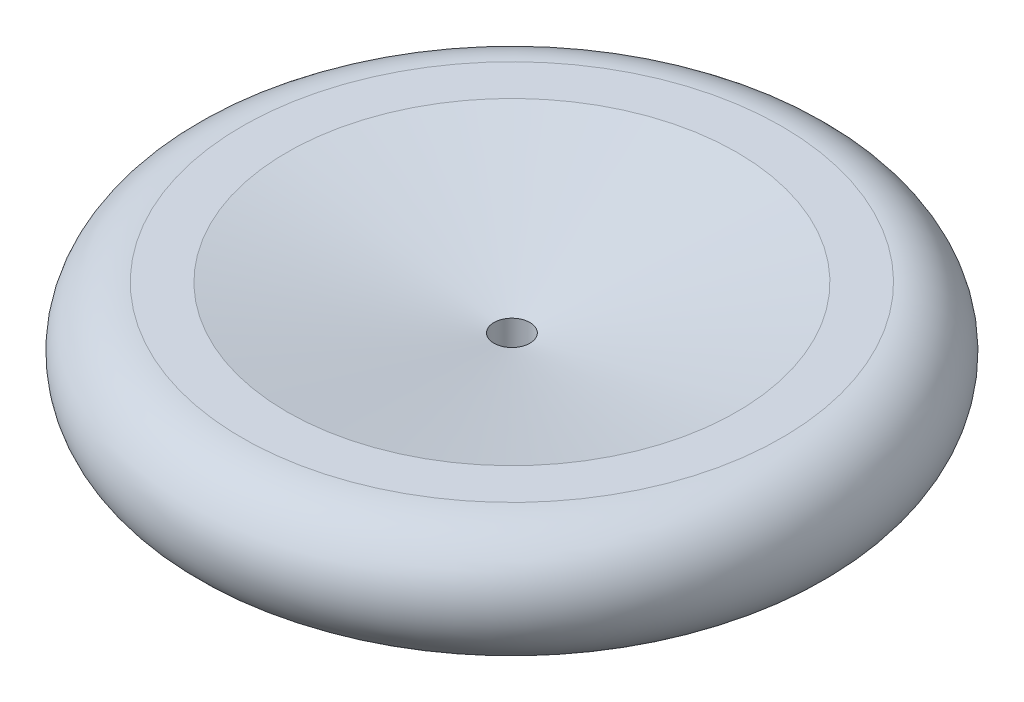
ISO-10303-21;
HEADER;
FILE_DESCRIPTION(('STEP AP214'),'2;1');
FILE_NAME('part.step','',(''),(''),'','','');
FILE_SCHEMA(('AUTOMOTIVE_DESIGN { 1 0 10303 214 1 1 1 1 }'));
ENDSEC;
DATA;
#1=APPLICATION_CONTEXT('core data for automotive mechanical design processes');
#2=APPLICATION_PROTOCOL_DEFINITION('international standard','automotive_design',2000,#1);
#3=PRODUCT_CONTEXT('',#1,'mechanical');
#4=PRODUCT('Part','Part','',(#3));
#5=PRODUCT_RELATED_PRODUCT_CATEGORY('part','',(#4));
#6=PRODUCT_DEFINITION_FORMATION('','',#4);
#7=PRODUCT_DEFINITION_CONTEXT('part definition',#1,'design');
#8=PRODUCT_DEFINITION('design','',#6,#7);
#9=PRODUCT_DEFINITION_SHAPE('','',#8);
#10=(LENGTH_UNIT() NAMED_UNIT(*) SI_UNIT(.MILLI.,.METRE.));
#11=(NAMED_UNIT(*) PLANE_ANGLE_UNIT() SI_UNIT($,.RADIAN.));
#12=(NAMED_UNIT(*) SI_UNIT($,.STERADIAN.) SOLID_ANGLE_UNIT());
#13=UNCERTAINTY_MEASURE_WITH_UNIT(LENGTH_MEASURE(1.E-05),#10,'distance_accuracy_value','');
#14=(GEOMETRIC_REPRESENTATION_CONTEXT(3) GLOBAL_UNCERTAINTY_ASSIGNED_CONTEXT((#13)) GLOBAL_UNIT_ASSIGNED_CONTEXT((#10,
#11,#12)) REPRESENTATION_CONTEXT('',''));
#15=CARTESIAN_POINT('',(0.,0.,0.));
#16=DIRECTION('',(0.,0.,1.));
#17=DIRECTION('',(1.,0.,0.));
#18=AXIS2_PLACEMENT_3D('',#15,#16,#17);
#19=CARTESIAN_POINT('',(0.,-13.277601836821,0.));
#20=DIRECTION('',(0.,-1.,0.));
#21=DIRECTION('',(0.,0.,-1.));
#22=AXIS2_PLACEMENT_3D('',#19,#20,#21);
#23=PLANE('',#22);
#24=CARTESIAN_POINT('',(0.,-13.277601836821,0.));
#25=DIRECTION('',(0.,-1.,0.));
#26=DIRECTION('',(0.,0.,-1.));
#27=AXIS2_PLACEMENT_3D('',#24,#25,#26);
#28=CIRCLE('',#27,60.);
#29=CARTESIAN_POINT('',(0.,-13.277601836821,-60.));
#30=VERTEX_POINT('',#29);
#31=EDGE_CURVE('E10',#30,#30,#28,.T.);
#32=ORIENTED_EDGE('',*,*,#31,.T.);
#33=EDGE_LOOP('',(#32));
#34=FACE_BOUND('',#33,.T.);
#35=CARTESIAN_POINT('',(0.,-13.277601836821,0.));
#36=DIRECTION('',(0.,-1.,0.));
#37=DIRECTION('',(0.,0.,-1.));
#38=AXIS2_PLACEMENT_3D('',#35,#36,#37);
#39=CIRCLE('',#38,50.);
#40=CARTESIAN_POINT('',(0.,-13.277601836821,-50.));
#41=VERTEX_POINT('',#40);
#42=EDGE_CURVE('E63',#41,#41,#39,.T.);
#43=ORIENTED_EDGE('',*,*,#42,.F.);
#44=EDGE_LOOP('',(#43));
#45=FACE_BOUND('',#44,.T.);
#46=ADVANCED_FACE('F41',(#34,#45),#23,.T.);
#47=CARTESIAN_POINT('',(0.,0.,0.));
#48=DIRECTION('',(0.,-1.,0.));
#49=DIRECTION('',(0.,0.,-1.));
#50=AXIS2_PLACEMENT_3D('',#47,#48,#49);
#51=TOROIDAL_SURFACE('',#50,60.,13.277601836821);
#52=CARTESIAN_POINT('',(0.,13.277601836821,0.));
#53=DIRECTION('',(0.,-1.,0.));
#54=DIRECTION('',(0.,0.,-1.));
#55=AXIS2_PLACEMENT_3D('',#52,#53,#54);
#56=CIRCLE('',#55,60.);
#57=CARTESIAN_POINT('',(0.,13.277601836821,-60.));
#58=VERTEX_POINT('',#57);
#59=EDGE_CURVE('E47',#58,#58,#56,.T.);
#60=ORIENTED_EDGE('',*,*,#59,.T.);
#61=EDGE_LOOP('',(#60));
#62=FACE_BOUND('',#61,.T.);
#63=ORIENTED_EDGE('',*,*,#31,.F.);
#64=EDGE_LOOP('',(#63));
#65=FACE_BOUND('',#64,.T.);
#66=ADVANCED_FACE('F71',(#62,#65),#51,.T.);
#67=CARTESIAN_POINT('',(0.,13.277601836821,0.));
#68=DIRECTION('',(0.,-1.,0.));
#69=DIRECTION('',(0.,0.,-1.));
#70=AXIS2_PLACEMENT_3D('',#67,#68,#69);
#71=PLANE('',#70);
#72=ORIENTED_EDGE('',*,*,#59,.F.);
#73=EDGE_LOOP('',(#72));
#74=FACE_BOUND('',#73,.T.);
#75=CARTESIAN_POINT('',(0.,13.277601836821,0.));
#76=DIRECTION('',(0.,-1.,0.));
#77=DIRECTION('',(0.,0.,-1.));
#78=AXIS2_PLACEMENT_3D('',#75,#76,#77);
#79=CIRCLE('',#78,50.);
#80=CARTESIAN_POINT('',(0.,13.277601836821,50.));
#81=VERTEX_POINT('',#80);
#82=EDGE_CURVE('E51',#81,#81,#79,.T.);
#83=ORIENTED_EDGE('',*,*,#82,.T.);
#84=EDGE_LOOP('',(#83));
#85=FACE_BOUND('',#84,.T.);
#86=ADVANCED_FACE('F75',(#74,#85),#71,.F.);
#87=CARTESIAN_POINT('',(0.,3.5,0.));
#88=DIRECTION('',(0.,1.,0.));
#89=DIRECTION('',(0.,0.,1.));
#90=AXIS2_PLACEMENT_3D('',#87,#88,#89);
#91=CONICAL_SURFACE('',#90,4.,1.36135681655558);
#92=CARTESIAN_POINT('',(0.,3.5,0.));
#93=DIRECTION('',(0.,-1.,0.));
#94=DIRECTION('',(0.,0.,-1.));
#95=AXIS2_PLACEMENT_3D('',#92,#93,#94);
#96=CIRCLE('',#95,4.);
#97=CARTESIAN_POINT('',(0.,3.5,4.));
#98=VERTEX_POINT('',#97);
#99=EDGE_CURVE('E55',#98,#98,#96,.T.);
#100=CARTESIAN_POINT('',(0.,13.277601836821,50.));
#101=CARTESIAN_POINT('',(0.,13.1757518176875,49.5208333333333));
#102=CARTESIAN_POINT('',(0.,13.0739017985539,49.0416666666667));
#103=CARTESIAN_POINT('',(0.,12.8702017602868,48.0833333333333));
#104=CARTESIAN_POINT('',(0.,12.7683517411533,47.6041666666667));
#105=CARTESIAN_POINT('',(0.,12.5646517028862,46.6458333333333));
#106=CARTESIAN_POINT('',(0.,12.4628016837526,46.1666666666667));
#107=CARTESIAN_POINT('',(0.,12.2591016454855,45.2083333333333));
#108=CARTESIAN_POINT('',(0.,12.157251626352,44.7291666666667));
#109=CARTESIAN_POINT('',(0.,11.9535515880849,43.7708333333333));
#110=CARTESIAN_POINT('',(0.,11.8517015689513,43.2916666666667));
#111=CARTESIAN_POINT('',(0.,11.6480015306842,42.3333333333333));
#112=CARTESIAN_POINT('',(0.,11.5461515115507,41.8541666666667));
#113=CARTESIAN_POINT('',(0.,11.3424514732835,40.8958333333333));
#114=CARTESIAN_POINT('',(0.,11.24060145415,40.4166666666667));
#115=CARTESIAN_POINT('',(0.,11.0369014158829,39.4583333333333));
#116=CARTESIAN_POINT('',(0.,10.9350513967493,38.9791666666667));
#117=CARTESIAN_POINT('',(0.,10.7313513584822,38.0208333333333));
#118=CARTESIAN_POINT('',(0.,10.6295013393487,37.5416666666667));
#119=CARTESIAN_POINT('',(0.,10.4258013010816,36.5833333333333));
#120=CARTESIAN_POINT('',(0.,10.323951281948,36.1041666666667));
#121=CARTESIAN_POINT('',(0.,10.1202512436809,35.1458333333333));
#122=CARTESIAN_POINT('',(0.,10.0184012245474,34.6666666666667));
#123=CARTESIAN_POINT('',(0.,9.81470118628026,33.7083333333333));
#124=CARTESIAN_POINT('',(0.,9.7128511671467,33.2291666666667));
#125=CARTESIAN_POINT('',(0.,9.5091511288796,32.2708333333333));
#126=CARTESIAN_POINT('',(0.,9.40730110974605,31.7916666666667));
#127=CARTESIAN_POINT('',(0.,9.20360107147894,30.8333333333333));
#128=CARTESIAN_POINT('',(0.,9.10175105234539,30.3541666666667));
#129=CARTESIAN_POINT('',(0.,8.89805101407828,29.3958333333333));
#130=CARTESIAN_POINT('',(0.,8.79620099494473,28.9166666666667));
#131=CARTESIAN_POINT('',(0.,8.59250095667763,27.9583333333333));
#132=CARTESIAN_POINT('',(0.,8.49065093754407,27.4791666666667));
#133=CARTESIAN_POINT('',(0.,8.28695089927697,26.5208333333333));
#134=CARTESIAN_POINT('',(0.,8.18510088014342,26.0416666666667));
#135=CARTESIAN_POINT('',(0.,7.98140084187631,25.0833333333333));
#136=CARTESIAN_POINT('',(0.,7.87955082274276,24.6041666666667));
#137=CARTESIAN_POINT('',(0.,7.67585078447565,23.6458333333333));
#138=CARTESIAN_POINT('',(0.,7.5740007653421,23.1666666666667));
#139=CARTESIAN_POINT('',(0.,7.370300727075,22.2083333333333));
#140=CARTESIAN_POINT('',(0.,7.26845070794144,21.7291666666667));
#141=CARTESIAN_POINT('',(0.,7.06475066967434,20.7708333333333));
#142=CARTESIAN_POINT('',(0.,6.96290065054079,20.2916666666667));
#143=CARTESIAN_POINT('',(0.,6.75920061227368,19.3333333333333));
#144=CARTESIAN_POINT('',(0.,6.65735059314013,18.8541666666667));
#145=CARTESIAN_POINT('',(0.,6.45365055487302,17.8958333333333));
#146=CARTESIAN_POINT('',(0.,6.35180053573947,17.4166666666667));
#147=CARTESIAN_POINT('',(0.,6.14810049747237,16.4583333333333));
#148=CARTESIAN_POINT('',(0.,6.04625047833881,15.9791666666667));
#149=CARTESIAN_POINT('',(0.,5.84255044007171,15.0208333333333));
#150=CARTESIAN_POINT('',(0.,5.74070042093816,14.5416666666667));
#151=CARTESIAN_POINT('',(0.,5.53700038267105,13.5833333333333));
#152=CARTESIAN_POINT('',(0.,5.4351503635375,13.1041666666667));
#153=CARTESIAN_POINT('',(0.,5.23145032527039,12.1458333333333));
#154=CARTESIAN_POINT('',(0.,5.12960030613684,11.6666666666667));
#155=CARTESIAN_POINT('',(0.,4.92590026786974,10.7083333333333));
#156=CARTESIAN_POINT('',(0.,4.82405024873618,10.2291666666667));
#157=CARTESIAN_POINT('',(0.,4.62035021046908,9.27083333333333));
#158=CARTESIAN_POINT('',(0.,4.51850019133552,8.79166666666667));
#159=CARTESIAN_POINT('',(0.,4.31480015306842,7.83333333333333));
#160=CARTESIAN_POINT('',(0.,4.21295013393487,7.35416666666667));
#161=CARTESIAN_POINT('',(0.,4.00925009566776,6.39583333333333));
#162=CARTESIAN_POINT('',(0.,3.90740007653421,5.91666666666667));
#163=CARTESIAN_POINT('',(0.,3.70370003826711,4.95833333333333));
#164=CARTESIAN_POINT('',(0.,3.60185001913355,4.47916666666667));
#165=CARTESIAN_POINT('',(0.,3.5,4.));
#166=B_SPLINE_CURVE_WITH_KNOTS('',3,(#100,#101,#102,#103,#104,#105,#106,#107,#108,#109,#110,
#111,#112,#113,#114,#115,#116,#117,#118,#119,#120,#121,#122,#123,#124,#125,#126,#127,#128,#129,
#130,#131,#132,#133,#134,#135,#136,#137,#138,#139,#140,#141,#142,#143,#144,#145,#146,#147,#148,
#149,#150,#151,#152,#153,#154,#155,#156,#157,#158,#159,#160,#161,#162,#163,#164,#165),
.UNSPECIFIED.,.F.,.F.,(4,2,2,2,2,2,2,2,2,2,2,2,2,2,2,2,2,2,2,2,2,2,2,2,2,2,2,2,2,2,2,2,4),(0.,
1.46961460511847,2.93922921023696,4.40884381535544,5.87845842047392,7.3480730255924,
8.81768763071089,10.2873022358294,11.7569168409478,13.2265314460663,14.6961460511848,
16.1657606563033,17.6353752614218,19.1049898665402,20.5746044716587,22.0442190767772,
23.5138336818957,24.9834482870142,26.4530628921326,27.9226774972511,29.3922921023696,
30.8619067074881,32.3315213126065,33.801135917725,35.2707505228435,36.740365127962,
38.2099797330805,39.6795943381989,41.1492089433174,42.6188235484359,44.0884381535544,
45.5580527586729,47.0276673637913),.UNSPECIFIED.);
#167=EDGE_CURVE('BSEAM79',#81,#98,#166,.T.);
#168=ORIENTED_EDGE('',*,*,#82,.F.);
#169=ORIENTED_EDGE('',*,*,#99,.T.);
#170=ORIENTED_EDGE('',*,*,#167,.T.);
#171=ORIENTED_EDGE('',*,*,#167,.F.);
#172=EDGE_LOOP('',(#168,#170,#169,#171));
#173=FACE_BOUND('',#172,.T.);
#174=ADVANCED_FACE('F79',(#173),#91,.F.);
#175=CARTESIAN_POINT('',(0.,0.,0.));
#176=DIRECTION('',(0.,-1.,0.));
#177=DIRECTION('',(0.,0.,-1.));
#178=AXIS2_PLACEMENT_3D('',#175,#176,#177);
#179=CYLINDRICAL_SURFACE('',#178,4.);
#180=ORIENTED_EDGE('',*,*,#99,.F.);
#181=EDGE_LOOP('',(#180));
#182=FACE_BOUND('',#181,.T.);
#183=CARTESIAN_POINT('',(0.,-3.5,0.));
#184=DIRECTION('',(0.,-1.,0.));
#185=DIRECTION('',(0.,0.,-1.));
#186=AXIS2_PLACEMENT_3D('',#183,#184,#185);
#187=CIRCLE('',#186,4.);
#188=CARTESIAN_POINT('',(0.,-3.5,-4.));
#189=VERTEX_POINT('',#188);
#190=EDGE_CURVE('E60',#189,#189,#187,.T.);
#191=ORIENTED_EDGE('',*,*,#190,.T.);
#192=EDGE_LOOP('',(#191));
#193=FACE_BOUND('',#192,.T.);
#194=ADVANCED_FACE('F86',(#182,#193),#179,.F.);
#195=CARTESIAN_POINT('',(0.,-3.5,0.));
#196=DIRECTION('',(0.,-1.,0.));
#197=DIRECTION('',(0.,0.,-1.));
#198=AXIS2_PLACEMENT_3D('',#195,#196,#197);
#199=CONICAL_SURFACE('',#198,4.,1.36135681655558);
#200=CARTESIAN_POINT('',(0.,-13.277601836821,-50.));
#201=CARTESIAN_POINT('',(0.,-13.1757518176875,-49.5208333333333));
#202=CARTESIAN_POINT('',(0.,-13.0739017985539,-49.0416666666667));
#203=CARTESIAN_POINT('',(0.,-12.8702017602868,-48.0833333333333));
#204=CARTESIAN_POINT('',(0.,-12.7683517411533,-47.6041666666667));
#205=CARTESIAN_POINT('',(0.,-12.5646517028862,-46.6458333333333));
#206=CARTESIAN_POINT('',(0.,-12.4628016837526,-46.1666666666667));
#207=CARTESIAN_POINT('',(0.,-12.2591016454855,-45.2083333333333));
#208=CARTESIAN_POINT('',(0.,-12.157251626352,-44.7291666666667));
#209=CARTESIAN_POINT('',(0.,-11.9535515880849,-43.7708333333333));
#210=CARTESIAN_POINT('',(0.,-11.8517015689513,-43.2916666666667));
#211=CARTESIAN_POINT('',(0.,-11.6480015306842,-42.3333333333333));
#212=CARTESIAN_POINT('',(0.,-11.5461515115507,-41.8541666666667));
#213=CARTESIAN_POINT('',(0.,-11.3424514732835,-40.8958333333333));
#214=CARTESIAN_POINT('',(0.,-11.24060145415,-40.4166666666667));
#215=CARTESIAN_POINT('',(0.,-11.0369014158829,-39.4583333333333));
#216=CARTESIAN_POINT('',(0.,-10.9350513967493,-38.9791666666667));
#217=CARTESIAN_POINT('',(0.,-10.7313513584822,-38.0208333333333));
#218=CARTESIAN_POINT('',(0.,-10.6295013393487,-37.5416666666667));
#219=CARTESIAN_POINT('',(0.,-10.4258013010816,-36.5833333333333));
#220=CARTESIAN_POINT('',(0.,-10.323951281948,-36.1041666666667));
#221=CARTESIAN_POINT('',(0.,-10.1202512436809,-35.1458333333333));
#222=CARTESIAN_POINT('',(0.,-10.0184012245474,-34.6666666666667));
#223=CARTESIAN_POINT('',(0.,-9.81470118628026,-33.7083333333333));
#224=CARTESIAN_POINT('',(0.,-9.7128511671467,-33.2291666666667));
#225=CARTESIAN_POINT('',(0.,-9.5091511288796,-32.2708333333333));
#226=CARTESIAN_POINT('',(0.,-9.40730110974605,-31.7916666666667));
#227=CARTESIAN_POINT('',(0.,-9.20360107147894,-30.8333333333333));
#228=CARTESIAN_POINT('',(0.,-9.10175105234539,-30.3541666666667));
#229=CARTESIAN_POINT('',(0.,-8.89805101407828,-29.3958333333333));
#230=CARTESIAN_POINT('',(0.,-8.79620099494473,-28.9166666666667));
#231=CARTESIAN_POINT('',(0.,-8.59250095667763,-27.9583333333333));
#232=CARTESIAN_POINT('',(0.,-8.49065093754407,-27.4791666666667));
#233=CARTESIAN_POINT('',(0.,-8.28695089927697,-26.5208333333333));
#234=CARTESIAN_POINT('',(0.,-8.18510088014342,-26.0416666666667));
#235=CARTESIAN_POINT('',(0.,-7.98140084187631,-25.0833333333333));
#236=CARTESIAN_POINT('',(0.,-7.87955082274276,-24.6041666666667));
#237=CARTESIAN_POINT('',(0.,-7.67585078447565,-23.6458333333333));
#238=CARTESIAN_POINT('',(0.,-7.5740007653421,-23.1666666666667));
#239=CARTESIAN_POINT('',(0.,-7.370300727075,-22.2083333333333));
#240=CARTESIAN_POINT('',(0.,-7.26845070794144,-21.7291666666667));
#241=CARTESIAN_POINT('',(0.,-7.06475066967434,-20.7708333333333));
#242=CARTESIAN_POINT('',(0.,-6.96290065054079,-20.2916666666667));
#243=CARTESIAN_POINT('',(0.,-6.75920061227368,-19.3333333333333));
#244=CARTESIAN_POINT('',(0.,-6.65735059314013,-18.8541666666667));
#245=CARTESIAN_POINT('',(0.,-6.45365055487302,-17.8958333333333));
#246=CARTESIAN_POINT('',(0.,-6.35180053573947,-17.4166666666667));
#247=CARTESIAN_POINT('',(0.,-6.14810049747237,-16.4583333333333));
#248=CARTESIAN_POINT('',(0.,-6.04625047833881,-15.9791666666667));
#249=CARTESIAN_POINT('',(0.,-5.84255044007171,-15.0208333333333));
#250=CARTESIAN_POINT('',(0.,-5.74070042093816,-14.5416666666667));
#251=CARTESIAN_POINT('',(0.,-5.53700038267105,-13.5833333333333));
#252=CARTESIAN_POINT('',(0.,-5.4351503635375,-13.1041666666667));
#253=CARTESIAN_POINT('',(0.,-5.23145032527039,-12.1458333333333));
#254=CARTESIAN_POINT('',(0.,-5.12960030613684,-11.6666666666667));
#255=CARTESIAN_POINT('',(0.,-4.92590026786974,-10.7083333333333));
#256=CARTESIAN_POINT('',(0.,-4.82405024873618,-10.2291666666667));
#257=CARTESIAN_POINT('',(0.,-4.62035021046908,-9.27083333333333));
#258=CARTESIAN_POINT('',(0.,-4.51850019133552,-8.79166666666667));
#259=CARTESIAN_POINT('',(0.,-4.31480015306842,-7.83333333333333));
#260=CARTESIAN_POINT('',(0.,-4.21295013393487,-7.35416666666667));
#261=CARTESIAN_POINT('',(0.,-4.00925009566776,-6.39583333333333));
#262=CARTESIAN_POINT('',(0.,-3.90740007653421,-5.91666666666667));
#263=CARTESIAN_POINT('',(0.,-3.7037000382671,-4.95833333333333));
#264=CARTESIAN_POINT('',(0.,-3.60185001913355,-4.47916666666667));
#265=CARTESIAN_POINT('',(0.,-3.5,-4.));
#266=B_SPLINE_CURVE_WITH_KNOTS('',3,(#200,#201,#202,#203,#204,#205,#206,#207,#208,#209,#210,
#211,#212,#213,#214,#215,#216,#217,#218,#219,#220,#221,#222,#223,#224,#225,#226,#227,#228,#229,
#230,#231,#232,#233,#234,#235,#236,#237,#238,#239,#240,#241,#242,#243,#244,#245,#246,#247,#248,
#249,#250,#251,#252,#253,#254,#255,#256,#257,#258,#259,#260,#261,#262,#263,#264,#265),
.UNSPECIFIED.,.F.,.F.,(4,2,2,2,2,2,2,2,2,2,2,2,2,2,2,2,2,2,2,2,2,2,2,2,2,2,2,2,2,2,2,2,4),(0.,
1.46961460511847,2.93922921023696,4.40884381535544,5.87845842047392,7.34807302559239,
8.81768763071088,10.2873022358294,11.7569168409478,13.2265314460663,14.6961460511848,
16.1657606563033,17.6353752614218,19.1049898665402,20.5746044716587,22.0442190767772,
23.5138336818957,24.9834482870142,26.4530628921326,27.9226774972511,29.3922921023696,
30.8619067074881,32.3315213126065,33.801135917725,35.2707505228435,36.740365127962,
38.2099797330805,39.6795943381989,41.1492089433174,42.6188235484359,44.0884381535544,
45.5580527586729,47.0276673637913),.UNSPECIFIED.);
#267=EDGE_CURVE('BSEAM67',#41,#189,#266,.T.);
#268=ORIENTED_EDGE('',*,*,#42,.T.);
#269=ORIENTED_EDGE('',*,*,#190,.F.);
#270=ORIENTED_EDGE('',*,*,#267,.T.);
#271=ORIENTED_EDGE('',*,*,#267,.F.);
#272=EDGE_LOOP('',(#268,#270,#269,#271));
#273=FACE_BOUND('',#272,.T.);
#274=ADVANCED_FACE('F67',(#273),#199,.F.);
#275=CLOSED_SHELL('',(#46,#66,#86,#174,#194,#274));
#276=MANIFOLD_SOLID_BREP('B2',#275);
#277=ADVANCED_BREP_SHAPE_REPRESENTATION('',(#18,#276),#14);
#278=SHAPE_DEFINITION_REPRESENTATION(#9,#277);
ENDSEC;
END-ISO-10303-21;
